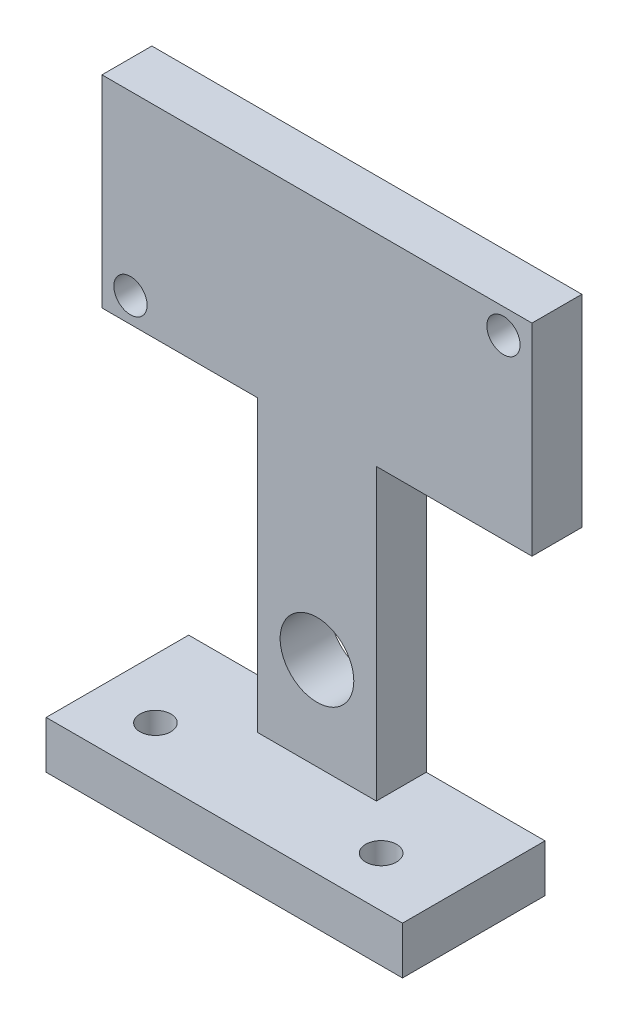
ISO-10303-21;
HEADER;
FILE_DESCRIPTION(('STEP AP214'),'2;1');
FILE_NAME('part.step','',(''),(''),'','','');
FILE_SCHEMA(('AUTOMOTIVE_DESIGN { 1 0 10303 214 1 1 1 1 }'));
ENDSEC;
DATA;
#1=APPLICATION_CONTEXT('core data for automotive mechanical design processes');
#2=APPLICATION_PROTOCOL_DEFINITION('international standard','automotive_design',2000,#1);
#3=PRODUCT_CONTEXT('',#1,'mechanical');
#4=PRODUCT('Part','Part','',(#3));
#5=PRODUCT_RELATED_PRODUCT_CATEGORY('part','',(#4));
#6=PRODUCT_DEFINITION_FORMATION('','',#4);
#7=PRODUCT_DEFINITION_CONTEXT('part definition',#1,'design');
#8=PRODUCT_DEFINITION('design','',#6,#7);
#9=PRODUCT_DEFINITION_SHAPE('','',#8);
#10=(LENGTH_UNIT() NAMED_UNIT(*) SI_UNIT(.MILLI.,.METRE.));
#11=(NAMED_UNIT(*) PLANE_ANGLE_UNIT() SI_UNIT($,.RADIAN.));
#12=(NAMED_UNIT(*) SI_UNIT($,.STERADIAN.) SOLID_ANGLE_UNIT());
#13=UNCERTAINTY_MEASURE_WITH_UNIT(LENGTH_MEASURE(1.E-05),#10,'distance_accuracy_value','');
#14=(GEOMETRIC_REPRESENTATION_CONTEXT(3) GLOBAL_UNCERTAINTY_ASSIGNED_CONTEXT((#13)) GLOBAL_UNIT_ASSIGNED_CONTEXT((#10,
#11,#12)) REPRESENTATION_CONTEXT('',''));
#15=CARTESIAN_POINT('',(0.,0.,0.));
#16=DIRECTION('',(0.,0.,1.));
#17=DIRECTION('',(1.,0.,0.));
#18=AXIS2_PLACEMENT_3D('',#15,#16,#17);
#19=CARTESIAN_POINT('',(-100.96160810836,-5.08,-61.813229454098));
#20=DIRECTION('',(-1.,0.,0.));
#21=DIRECTION('',(0.,0.,1.));
#22=AXIS2_PLACEMENT_3D('',#19,#20,#21);
#23=PLANE('',#22);
#24=DIRECTION('',(0.,0.,1.));
#25=VECTOR('',#24,1.);
#26=CARTESIAN_POINT('',(-100.96160810836,0.,-61.813229454098));
#27=LINE('',#26,#25);
#28=CARTESIAN_POINT('',(-100.96160810836,0.,-61.813229454098));
#29=VERTEX_POINT('',#28);
#30=CARTESIAN_POINT('',(-100.96160810836,0.,-46.573229454098));
#31=VERTEX_POINT('',#30);
#32=EDGE_CURVE('E226',#29,#31,#27,.T.);
#33=ORIENTED_EDGE('',*,*,#32,.F.);
#34=DIRECTION('',(0.,1.,0.));
#35=VECTOR('',#34,1.);
#36=CARTESIAN_POINT('',(-100.96160810836,-5.08,-61.813229454098));
#37=LINE('',#36,#35);
#38=CARTESIAN_POINT('',(-100.96160810836,-5.08,-61.813229454098));
#39=VERTEX_POINT('',#38);
#40=EDGE_CURVE('E11',#39,#29,#37,.T.);
#41=ORIENTED_EDGE('',*,*,#40,.F.);
#42=DIRECTION('',(0.,0.,1.));
#43=VECTOR('',#42,1.);
#44=CARTESIAN_POINT('',(-100.96160810836,-5.08,-61.813229454098));
#45=LINE('',#44,#43);
#46=CARTESIAN_POINT('',(-100.96160810836,-5.08,-46.573229454098));
#47=VERTEX_POINT('',#46);
#48=EDGE_CURVE('E229',#39,#47,#45,.T.);
#49=ORIENTED_EDGE('',*,*,#48,.T.);
#50=DIRECTION('',(0.,1.,0.));
#51=VECTOR('',#50,1.);
#52=CARTESIAN_POINT('',(-100.96160810836,-5.08,-46.573229454098));
#53=LINE('',#52,#51);
#54=EDGE_CURVE('E242',#47,#31,#53,.T.);
#55=ORIENTED_EDGE('',*,*,#54,.T.);
#56=EDGE_LOOP('',(#33,#41,#49,#55));
#57=FACE_BOUND('',#56,.T.);
#58=ADVANCED_FACE('F33',(#57),#23,.T.);
#59=CARTESIAN_POINT('',(-100.96160810836,-5.08,-61.813229454098));
#60=DIRECTION('',(0.,0.,-1.));
#61=DIRECTION('',(-1.,0.,0.));
#62=AXIS2_PLACEMENT_3D('',#59,#60,#61);
#63=PLANE('',#62);
#64=CARTESIAN_POINT('',(-81.91160810836,9.90599999999999,-61.813229454098));
#65=DIRECTION('',(0.,0.,-1.));
#66=DIRECTION('',(-1.,0.,0.));
#67=AXIS2_PLACEMENT_3D('',#64,#65,#66);
#68=CIRCLE('',#67,3.937);
#69=CARTESIAN_POINT('',(-85.84860810836,9.90599999999999,-61.813229454098));
#70=VERTEX_POINT('',#69);
#71=EDGE_CURVE('E345',#70,#70,#68,.T.);
#72=ORIENTED_EDGE('',*,*,#71,.F.);
#73=EDGE_LOOP('',(#72));
#74=FACE_BOUND('',#73,.T.);
#75=CARTESIAN_POINT('',(-61.97260810836,49.911,-61.813229454098));
#76=DIRECTION('',(0.,0.,-1.));
#77=DIRECTION('',(-1.,0.,0.));
#78=AXIS2_PLACEMENT_3D('',#75,#76,#77);
#79=CIRCLE('',#78,1.77800000000001);
#80=CARTESIAN_POINT('',(-63.75060810836,49.911,-61.813229454098));
#81=VERTEX_POINT('',#80);
#82=EDGE_CURVE('E355',#81,#81,#79,.T.);
#83=ORIENTED_EDGE('',*,*,#82,.F.);
#84=EDGE_LOOP('',(#83));
#85=FACE_BOUND('',#84,.T.);
#86=CARTESIAN_POINT('',(-101.85060810836,33.655,-61.813229454098));
#87=DIRECTION('',(0.,0.,-1.));
#88=DIRECTION('',(-1.,0.,0.));
#89=AXIS2_PLACEMENT_3D('',#86,#87,#88);
#90=CIRCLE('',#89,1.77800000000001);
#91=CARTESIAN_POINT('',(-103.62860810836,33.655,-61.813229454098));
#92=VERTEX_POINT('',#91);
#93=EDGE_CURVE('E361',#92,#92,#90,.T.);
#94=ORIENTED_EDGE('',*,*,#93,.F.);
#95=EDGE_LOOP('',(#94));
#96=FACE_BOUND('',#95,.T.);
#97=DIRECTION('',(-1.,0.,0.));
#98=VECTOR('',#97,1.);
#99=CARTESIAN_POINT('',(-100.96160810836,0.,-61.813229454098));
#100=LINE('',#99,#98);
#101=CARTESIAN_POINT('',(-62.86160810836,0.,-61.813229454098));
#102=VERTEX_POINT('',#101);
#103=CARTESIAN_POINT('',(-75.56160810836,0.,-61.813229454098));
#104=VERTEX_POINT('',#103);
#105=EDGE_CURVE('E233',#102,#104,#100,.T.);
#106=ORIENTED_EDGE('',*,*,#105,.F.);
#107=DIRECTION('',(0.,1.,0.));
#108=VECTOR('',#107,1.);
#109=CARTESIAN_POINT('',(-62.86160810836,-5.08,-61.813229454098));
#110=LINE('',#109,#108);
#111=CARTESIAN_POINT('',(-62.86160810836,-5.08,-61.813229454098));
#112=VERTEX_POINT('',#111);
#113=EDGE_CURVE('E41',#112,#102,#110,.T.);
#114=ORIENTED_EDGE('',*,*,#113,.F.);
#115=DIRECTION('',(-1.,0.,0.));
#116=VECTOR('',#115,1.);
#117=CARTESIAN_POINT('',(-100.96160810836,-5.08,-61.813229454098));
#118=LINE('',#117,#116);
#119=EDGE_CURVE('E239',#112,#39,#118,.T.);
#120=ORIENTED_EDGE('',*,*,#119,.T.);
#121=ORIENTED_EDGE('',*,*,#40,.T.);
#122=CARTESIAN_POINT('',(-88.26160810836,0.,-61.813229454098));
#123=VERTEX_POINT('',#122);
#124=EDGE_CURVE('E251',#123,#29,#100,.T.);
#125=ORIENTED_EDGE('',*,*,#124,.F.);
#126=DIRECTION('',(0.,-1.,0.));
#127=VECTOR('',#126,1.);
#128=CARTESIAN_POINT('',(-88.26160810836,30.988,-61.813229454098));
#129=LINE('',#128,#127);
#130=CARTESIAN_POINT('',(-88.26160810836,30.988,-61.813229454098));
#131=VERTEX_POINT('',#130);
#132=EDGE_CURVE('E184',#131,#123,#129,.T.);
#133=ORIENTED_EDGE('',*,*,#132,.F.);
#134=DIRECTION('',(-1.,0.,0.));
#135=VECTOR('',#134,1.);
#136=CARTESIAN_POINT('',(-104.89860810836,30.988,-61.813229454098));
#137=LINE('',#136,#135);
#138=CARTESIAN_POINT('',(-104.89860810836,30.988,-61.813229454098));
#139=VERTEX_POINT('',#138);
#140=EDGE_CURVE('E157',#131,#139,#137,.T.);
#141=ORIENTED_EDGE('',*,*,#140,.T.);
#142=DIRECTION('',(0.,-1.,0.));
#143=VECTOR('',#142,1.);
#144=CARTESIAN_POINT('',(-104.89860810836,52.578,-61.813229454098));
#145=LINE('',#144,#143);
#146=CARTESIAN_POINT('',(-104.89860810836,52.578,-61.813229454098));
#147=VERTEX_POINT('',#146);
#148=EDGE_CURVE('E164',#147,#139,#145,.T.);
#149=ORIENTED_EDGE('',*,*,#148,.F.);
#150=DIRECTION('',(-1.,0.,0.));
#151=VECTOR('',#150,1.);
#152=CARTESIAN_POINT('',(-104.89860810836,52.578,-61.813229454098));
#153=LINE('',#152,#151);
#154=CARTESIAN_POINT('',(-58.92460810836,52.578,-61.813229454098));
#155=VERTEX_POINT('',#154);
#156=EDGE_CURVE('E139',#155,#147,#153,.T.);
#157=ORIENTED_EDGE('',*,*,#156,.F.);
#158=DIRECTION('',(0.,-1.,0.));
#159=VECTOR('',#158,1.);
#160=CARTESIAN_POINT('',(-58.92460810836,52.578,-61.813229454098));
#161=LINE('',#160,#159);
#162=CARTESIAN_POINT('',(-58.92460810836,30.988,-61.813229454098));
#163=VERTEX_POINT('',#162);
#164=EDGE_CURVE('E150',#155,#163,#161,.T.);
#165=ORIENTED_EDGE('',*,*,#164,.T.);
#166=CARTESIAN_POINT('',(-75.56160810836,30.988,-61.813229454098));
#167=VERTEX_POINT('',#166);
#168=EDGE_CURVE('E143',#163,#167,#137,.T.);
#169=ORIENTED_EDGE('',*,*,#168,.T.);
#170=DIRECTION('',(0.,-1.,0.));
#171=VECTOR('',#170,1.);
#172=CARTESIAN_POINT('',(-75.56160810836,30.988,-61.813229454098));
#173=LINE('',#172,#171);
#174=EDGE_CURVE('E188',#167,#104,#173,.T.);
#175=ORIENTED_EDGE('',*,*,#174,.T.);
#176=EDGE_LOOP('',(#106,#114,#120,#121,#125,#133,#141,#149,#157,#165,#169,#175));
#177=FACE_BOUND('',#176,.T.);
#178=ADVANCED_FACE('F171',(#74,#85,#96,#177),#63,.T.);
#179=CARTESIAN_POINT('',(-62.86160810836,-5.08,-61.813229454098));
#180=DIRECTION('',(1.,0.,0.));
#181=DIRECTION('',(0.,0.,-1.));
#182=AXIS2_PLACEMENT_3D('',#179,#180,#181);
#183=PLANE('',#182);
#184=DIRECTION('',(0.,0.,-1.));
#185=VECTOR('',#184,1.);
#186=CARTESIAN_POINT('',(-62.86160810836,0.,-61.813229454098));
#187=LINE('',#186,#185);
#188=CARTESIAN_POINT('',(-62.86160810836,0.,-46.573229454098));
#189=VERTEX_POINT('',#188);
#190=EDGE_CURVE('E248',#189,#102,#187,.T.);
#191=ORIENTED_EDGE('',*,*,#190,.F.);
#192=DIRECTION('',(0.,1.,0.));
#193=VECTOR('',#192,1.);
#194=CARTESIAN_POINT('',(-62.86160810836,-5.08,-46.573229454098));
#195=LINE('',#194,#193);
#196=CARTESIAN_POINT('',(-62.86160810836,-5.08,-46.573229454098));
#197=VERTEX_POINT('',#196);
#198=EDGE_CURVE('E259',#197,#189,#195,.T.);
#199=ORIENTED_EDGE('',*,*,#198,.F.);
#200=DIRECTION('',(0.,0.,-1.));
#201=VECTOR('',#200,1.);
#202=CARTESIAN_POINT('',(-62.86160810836,-5.08,-61.813229454098));
#203=LINE('',#202,#201);
#204=EDGE_CURVE('E236',#197,#112,#203,.T.);
#205=ORIENTED_EDGE('',*,*,#204,.T.);
#206=ORIENTED_EDGE('',*,*,#113,.T.);
#207=EDGE_LOOP('',(#191,#199,#205,#206));
#208=FACE_BOUND('',#207,.T.);
#209=ADVANCED_FACE('F262',(#208),#183,.T.);
#210=CARTESIAN_POINT('',(-100.96160810836,-5.08,-46.573229454098));
#211=DIRECTION('',(0.,0.,1.));
#212=DIRECTION('',(1.,0.,0.));
#213=AXIS2_PLACEMENT_3D('',#210,#211,#212);
#214=PLANE('',#213);
#215=DIRECTION('',(1.,0.,0.));
#216=VECTOR('',#215,1.);
#217=CARTESIAN_POINT('',(-100.96160810836,0.,-46.573229454098));
#218=LINE('',#217,#216);
#219=EDGE_CURVE('E245',#31,#189,#218,.T.);
#220=ORIENTED_EDGE('',*,*,#219,.F.);
#221=ORIENTED_EDGE('',*,*,#54,.F.);
#222=DIRECTION('',(1.,0.,0.));
#223=VECTOR('',#222,1.);
#224=CARTESIAN_POINT('',(-100.96160810836,-5.08,-46.573229454098));
#225=LINE('',#224,#223);
#226=EDGE_CURVE('E232',#47,#197,#225,.T.);
#227=ORIENTED_EDGE('',*,*,#226,.T.);
#228=ORIENTED_EDGE('',*,*,#198,.T.);
#229=EDGE_LOOP('',(#220,#221,#227,#228));
#230=FACE_BOUND('',#229,.T.);
#231=ADVANCED_FACE('F270',(#230),#214,.T.);
#232=CARTESIAN_POINT('',(0.,-5.08,0.));
#233=DIRECTION('',(0.,1.,0.));
#234=DIRECTION('',(0.,0.,1.));
#235=AXIS2_PLACEMENT_3D('',#232,#233,#234);
#236=PLANE('',#235);
#237=CARTESIAN_POINT('',(-70.48160810836,-5.08,-51.907229454098));
#238=DIRECTION('',(0.,1.,0.));
#239=DIRECTION('',(0.,0.,1.));
#240=AXIS2_PLACEMENT_3D('',#237,#238,#239);
#241=CIRCLE('',#240,1.65100000000001);
#242=CARTESIAN_POINT('',(-70.48160810836,-5.08,-50.256229454098));
#243=VERTEX_POINT('',#242);
#244=EDGE_CURVE('E208',#243,#243,#241,.T.);
#245=ORIENTED_EDGE('',*,*,#244,.T.);
#246=EDGE_LOOP('',(#245));
#247=FACE_BOUND('',#246,.T.);
#248=CARTESIAN_POINT('',(-94.61160810836,-5.08,-51.907229454098));
#249=DIRECTION('',(0.,1.,0.));
#250=DIRECTION('',(0.,0.,1.));
#251=AXIS2_PLACEMENT_3D('',#248,#249,#250);
#252=CIRCLE('',#251,1.65100000000001);
#253=CARTESIAN_POINT('',(-94.61160810836,-5.08,-50.256229454098));
#254=VERTEX_POINT('',#253);
#255=EDGE_CURVE('E223',#254,#254,#252,.T.);
#256=ORIENTED_EDGE('',*,*,#255,.T.);
#257=EDGE_LOOP('',(#256));
#258=FACE_BOUND('',#257,.T.);
#259=ORIENTED_EDGE('',*,*,#48,.F.);
#260=ORIENTED_EDGE('',*,*,#119,.F.);
#261=ORIENTED_EDGE('',*,*,#204,.F.);
#262=ORIENTED_EDGE('',*,*,#226,.F.);
#263=EDGE_LOOP('',(#259,#260,#261,#262));
#264=FACE_BOUND('',#263,.T.);
#265=ADVANCED_FACE('F274',(#247,#258,#264),#236,.F.);
#266=CARTESIAN_POINT('',(0.,0.,0.));
#267=DIRECTION('',(0.,1.,0.));
#268=DIRECTION('',(0.,0.,1.));
#269=AXIS2_PLACEMENT_3D('',#266,#267,#268);
#270=PLANE('',#269);
#271=DIRECTION('',(0.,0.,1.));
#272=VECTOR('',#271,1.);
#273=CARTESIAN_POINT('',(-88.26160810836,0.,-61.813229454098));
#274=LINE('',#273,#272);
#275=CARTESIAN_POINT('',(-88.26160810836,0.,-56.479229454098));
#276=VERTEX_POINT('',#275);
#277=EDGE_CURVE('E54',#123,#276,#274,.T.);
#278=ORIENTED_EDGE('',*,*,#277,.F.);
#279=ORIENTED_EDGE('',*,*,#124,.T.);
#280=ORIENTED_EDGE('',*,*,#32,.T.);
#281=ORIENTED_EDGE('',*,*,#219,.T.);
#282=ORIENTED_EDGE('',*,*,#190,.T.);
#283=ORIENTED_EDGE('',*,*,#105,.T.);
#284=DIRECTION('',(0.,0.,-1.));
#285=VECTOR('',#284,1.);
#286=CARTESIAN_POINT('',(-75.56160810836,0.,-61.813229454098));
#287=LINE('',#286,#285);
#288=CARTESIAN_POINT('',(-75.56160810836,0.,-56.479229454098));
#289=VERTEX_POINT('',#288);
#290=EDGE_CURVE('E191',#289,#104,#287,.T.);
#291=ORIENTED_EDGE('',*,*,#290,.F.);
#292=DIRECTION('',(1.,0.,0.));
#293=VECTOR('',#292,1.);
#294=CARTESIAN_POINT('',(-88.26160810836,0.,-56.479229454098));
#295=LINE('',#294,#293);
#296=EDGE_CURVE('E49',#276,#289,#295,.T.);
#297=ORIENTED_EDGE('',*,*,#296,.F.);
#298=EDGE_LOOP('',(#278,#279,#280,#281,#282,#283,#291,#297));
#299=FACE_BOUND('',#298,.T.);
#300=CARTESIAN_POINT('',(-70.48160810836,0.,-51.907229454098));
#301=DIRECTION('',(0.,1.,0.));
#302=DIRECTION('',(0.,0.,1.));
#303=AXIS2_PLACEMENT_3D('',#300,#301,#302);
#304=CIRCLE('',#303,1.65100000000001);
#305=CARTESIAN_POINT('',(-70.48160810836,0.,-50.256229454098));
#306=VERTEX_POINT('',#305);
#307=EDGE_CURVE('E215',#306,#306,#304,.T.);
#308=ORIENTED_EDGE('',*,*,#307,.F.);
#309=EDGE_LOOP('',(#308));
#310=FACE_BOUND('',#309,.T.);
#311=CARTESIAN_POINT('',(-94.61160810836,0.,-51.907229454098));
#312=DIRECTION('',(0.,1.,0.));
#313=DIRECTION('',(0.,0.,1.));
#314=AXIS2_PLACEMENT_3D('',#311,#312,#313);
#315=CIRCLE('',#314,1.65100000000001);
#316=CARTESIAN_POINT('',(-94.61160810836,0.,-50.256229454098));
#317=VERTEX_POINT('',#316);
#318=EDGE_CURVE('E221',#317,#317,#315,.T.);
#319=ORIENTED_EDGE('',*,*,#318,.F.);
#320=EDGE_LOOP('',(#319));
#321=FACE_BOUND('',#320,.T.);
#322=ADVANCED_FACE('F265',(#299,#310,#321),#270,.T.);
#323=CARTESIAN_POINT('',(-94.61160810836,-5.08,-51.907229454098));
#324=DIRECTION('',(0.,1.,0.));
#325=DIRECTION('',(0.,0.,1.));
#326=AXIS2_PLACEMENT_3D('',#323,#324,#325);
#327=CYLINDRICAL_SURFACE('',#326,1.65100000000001);
#328=ORIENTED_EDGE('',*,*,#255,.F.);
#329=EDGE_LOOP('',(#328));
#330=FACE_BOUND('',#329,.T.);
#331=ORIENTED_EDGE('',*,*,#318,.T.);
#332=EDGE_LOOP('',(#331));
#333=FACE_BOUND('',#332,.T.);
#334=ADVANCED_FACE('F300',(#330,#333),#327,.F.);
#335=CARTESIAN_POINT('',(-70.48160810836,-5.08,-51.907229454098));
#336=DIRECTION('',(0.,1.,0.));
#337=DIRECTION('',(0.,0.,1.));
#338=AXIS2_PLACEMENT_3D('',#335,#336,#337);
#339=CYLINDRICAL_SURFACE('',#338,1.65100000000001);
#340=ORIENTED_EDGE('',*,*,#244,.F.);
#341=EDGE_LOOP('',(#340));
#342=FACE_BOUND('',#341,.T.);
#343=ORIENTED_EDGE('',*,*,#307,.T.);
#344=EDGE_LOOP('',(#343));
#345=FACE_BOUND('',#344,.T.);
#346=ADVANCED_FACE('F305',(#342,#345),#339,.F.);
#347=CARTESIAN_POINT('',(-88.26160810836,30.988,-61.813229454098));
#348=DIRECTION('',(1.,0.,0.));
#349=DIRECTION('',(0.,0.,-1.));
#350=AXIS2_PLACEMENT_3D('',#347,#348,#349);
#351=PLANE('',#350);
#352=ORIENTED_EDGE('',*,*,#277,.T.);
#353=DIRECTION('',(0.,-1.,0.));
#354=VECTOR('',#353,1.);
#355=CARTESIAN_POINT('',(-88.26160810836,30.988,-56.479229454098));
#356=LINE('',#355,#354);
#357=CARTESIAN_POINT('',(-88.26160810836,30.988,-56.479229454098));
#358=VERTEX_POINT('',#357);
#359=EDGE_CURVE('E214',#358,#276,#356,.T.);
#360=ORIENTED_EDGE('',*,*,#359,.F.);
#361=DIRECTION('',(0.,0.,1.));
#362=VECTOR('',#361,1.);
#363=CARTESIAN_POINT('',(-88.26160810836,30.988,-61.813229454098));
#364=LINE('',#363,#362);
#365=EDGE_CURVE('E185',#131,#358,#364,.T.);
#366=ORIENTED_EDGE('',*,*,#365,.F.);
#367=ORIENTED_EDGE('',*,*,#132,.T.);
#368=EDGE_LOOP('',(#352,#360,#366,#367));
#369=FACE_BOUND('',#368,.T.);
#370=ADVANCED_FACE('F309',(#369),#351,.F.);
#371=CARTESIAN_POINT('',(-88.26160810836,30.988,-56.479229454098));
#372=DIRECTION('',(0.,0.,-1.));
#373=DIRECTION('',(-1.,0.,0.));
#374=AXIS2_PLACEMENT_3D('',#371,#372,#373);
#375=PLANE('',#374);
#376=CARTESIAN_POINT('',(-81.91160810836,9.90599999999999,-56.479229454098));
#377=DIRECTION('',(0.,0.,1.));
#378=DIRECTION('',(1.,0.,0.));
#379=AXIS2_PLACEMENT_3D('',#376,#377,#378);
#380=CIRCLE('',#379,3.937);
#381=CARTESIAN_POINT('',(-77.97460810836,9.90599999999999,-56.479229454098));
#382=VERTEX_POINT('',#381);
#383=EDGE_CURVE('E348',#382,#382,#380,.T.);
#384=ORIENTED_EDGE('',*,*,#383,.F.);
#385=EDGE_LOOP('',(#384));
#386=FACE_BOUND('',#385,.T.);
#387=CARTESIAN_POINT('',(-61.97260810836,49.911,-56.479229454098));
#388=DIRECTION('',(0.,0.,1.));
#389=DIRECTION('',(1.,0.,0.));
#390=AXIS2_PLACEMENT_3D('',#387,#388,#389);
#391=CIRCLE('',#390,1.77800000000001);
#392=CARTESIAN_POINT('',(-60.19460810836,49.911,-56.479229454098));
#393=VERTEX_POINT('',#392);
#394=EDGE_CURVE('E350',#393,#393,#391,.T.);
#395=ORIENTED_EDGE('',*,*,#394,.F.);
#396=EDGE_LOOP('',(#395));
#397=FACE_BOUND('',#396,.T.);
#398=CARTESIAN_POINT('',(-101.85060810836,33.655,-56.479229454098));
#399=DIRECTION('',(0.,0.,1.));
#400=DIRECTION('',(1.,0.,0.));
#401=AXIS2_PLACEMENT_3D('',#398,#399,#400);
#402=CIRCLE('',#401,1.77800000000001);
#403=CARTESIAN_POINT('',(-100.07260810836,33.655,-56.479229454098));
#404=VERTEX_POINT('',#403);
#405=EDGE_CURVE('E358',#404,#404,#402,.T.);
#406=ORIENTED_EDGE('',*,*,#405,.F.);
#407=EDGE_LOOP('',(#406));
#408=FACE_BOUND('',#407,.T.);
#409=ORIENTED_EDGE('',*,*,#296,.T.);
#410=DIRECTION('',(0.,-1.,0.));
#411=VECTOR('',#410,1.);
#412=CARTESIAN_POINT('',(-75.56160810836,30.988,-56.479229454098));
#413=LINE('',#412,#411);
#414=CARTESIAN_POINT('',(-75.56160810836,30.988,-56.479229454098));
#415=VERTEX_POINT('',#414);
#416=EDGE_CURVE('E198',#415,#289,#413,.T.);
#417=ORIENTED_EDGE('',*,*,#416,.F.);
#418=DIRECTION('',(1.,0.,0.));
#419=VECTOR('',#418,1.);
#420=CARTESIAN_POINT('',(-104.89860810836,30.988,-56.479229454098));
#421=LINE('',#420,#419);
#422=CARTESIAN_POINT('',(-58.92460810836,30.988,-56.479229454098));
#423=VERTEX_POINT('',#422);
#424=EDGE_CURVE('E181',#415,#423,#421,.T.);
#425=ORIENTED_EDGE('',*,*,#424,.T.);
#426=DIRECTION('',(0.,-1.,0.));
#427=VECTOR('',#426,1.);
#428=CARTESIAN_POINT('',(-58.92460810836,52.578,-56.479229454098));
#429=LINE('',#428,#427);
#430=CARTESIAN_POINT('',(-58.92460810836,52.578,-56.479229454098));
#431=VERTEX_POINT('',#430);
#432=EDGE_CURVE('E130',#431,#423,#429,.T.);
#433=ORIENTED_EDGE('',*,*,#432,.F.);
#434=DIRECTION('',(1.,0.,0.));
#435=VECTOR('',#434,1.);
#436=CARTESIAN_POINT('',(-104.89860810836,52.578,-56.479229454098));
#437=LINE('',#436,#435);
#438=CARTESIAN_POINT('',(-104.89860810836,52.578,-56.479229454098));
#439=VERTEX_POINT('',#438);
#440=EDGE_CURVE('E122',#439,#431,#437,.T.);
#441=ORIENTED_EDGE('',*,*,#440,.F.);
#442=DIRECTION('',(0.,-1.,0.));
#443=VECTOR('',#442,1.);
#444=CARTESIAN_POINT('',(-104.89860810836,52.578,-56.479229454098));
#445=LINE('',#444,#443);
#446=CARTESIAN_POINT('',(-104.89860810836,30.988,-56.479229454098));
#447=VERTEX_POINT('',#446);
#448=EDGE_CURVE('E127',#439,#447,#445,.T.);
#449=ORIENTED_EDGE('',*,*,#448,.T.);
#450=EDGE_CURVE('E368',#447,#358,#421,.T.);
#451=ORIENTED_EDGE('',*,*,#450,.T.);
#452=ORIENTED_EDGE('',*,*,#359,.T.);
#453=EDGE_LOOP('',(#409,#417,#425,#433,#441,#449,#451,#452));
#454=FACE_BOUND('',#453,.T.);
#455=ADVANCED_FACE('F124',(#386,#397,#408,#454),#375,.F.);
#456=CARTESIAN_POINT('',(-75.56160810836,30.988,-61.813229454098));
#457=DIRECTION('',(-1.,0.,0.));
#458=DIRECTION('',(0.,0.,1.));
#459=AXIS2_PLACEMENT_3D('',#456,#457,#458);
#460=PLANE('',#459);
#461=ORIENTED_EDGE('',*,*,#290,.T.);
#462=ORIENTED_EDGE('',*,*,#174,.F.);
#463=DIRECTION('',(0.,0.,-1.));
#464=VECTOR('',#463,1.);
#465=CARTESIAN_POINT('',(-75.56160810836,30.988,-61.813229454098));
#466=LINE('',#465,#464);
#467=EDGE_CURVE('E180',#415,#167,#466,.T.);
#468=ORIENTED_EDGE('',*,*,#467,.F.);
#469=ORIENTED_EDGE('',*,*,#416,.T.);
#470=EDGE_LOOP('',(#461,#462,#468,#469));
#471=FACE_BOUND('',#470,.T.);
#472=ADVANCED_FACE('F315',(#471),#460,.F.);
#473=CARTESIAN_POINT('',(0.,30.988,0.));
#474=DIRECTION('',(0.,1.,0.));
#475=DIRECTION('',(0.,0.,1.));
#476=AXIS2_PLACEMENT_3D('',#473,#474,#475);
#477=PLANE('',#476);
#478=ORIENTED_EDGE('',*,*,#140,.F.);
#479=ORIENTED_EDGE('',*,*,#365,.T.);
#480=ORIENTED_EDGE('',*,*,#450,.F.);
#481=DIRECTION('',(0.,0.,1.));
#482=VECTOR('',#481,1.);
#483=CARTESIAN_POINT('',(-104.89860810836,30.988,-61.813229454098));
#484=LINE('',#483,#482);
#485=EDGE_CURVE('E147',#139,#447,#484,.T.);
#486=ORIENTED_EDGE('',*,*,#485,.F.);
#487=EDGE_LOOP('',(#478,#479,#480,#486));
#488=FACE_BOUND('',#487,.T.);
#489=ADVANCED_FACE('F319',(#488),#477,.F.);
#490=ORIENTED_EDGE('',*,*,#424,.F.);
#491=ORIENTED_EDGE('',*,*,#467,.T.);
#492=ORIENTED_EDGE('',*,*,#168,.F.);
#493=DIRECTION('',(0.,0.,-1.));
#494=VECTOR('',#493,1.);
#495=CARTESIAN_POINT('',(-58.92460810836,30.988,-61.813229454098));
#496=LINE('',#495,#494);
#497=EDGE_CURVE('E162',#423,#163,#496,.T.);
#498=ORIENTED_EDGE('',*,*,#497,.F.);
#499=EDGE_LOOP('',(#490,#491,#492,#498));
#500=FACE_BOUND('',#499,.T.);
#501=ADVANCED_FACE('F178',(#500),#477,.F.);
#502=CARTESIAN_POINT('',(-104.89860810836,52.578,-61.813229454098));
#503=DIRECTION('',(1.,0.,0.));
#504=DIRECTION('',(0.,0.,-1.));
#505=AXIS2_PLACEMENT_3D('',#502,#503,#504);
#506=PLANE('',#505);
#507=ORIENTED_EDGE('',*,*,#485,.T.);
#508=ORIENTED_EDGE('',*,*,#448,.F.);
#509=DIRECTION('',(0.,0.,1.));
#510=VECTOR('',#509,1.);
#511=CARTESIAN_POINT('',(-104.89860810836,52.578,-61.813229454098));
#512=LINE('',#511,#510);
#513=EDGE_CURVE('E134',#147,#439,#512,.T.);
#514=ORIENTED_EDGE('',*,*,#513,.F.);
#515=ORIENTED_EDGE('',*,*,#148,.T.);
#516=EDGE_LOOP('',(#507,#508,#514,#515));
#517=FACE_BOUND('',#516,.T.);
#518=ADVANCED_FACE('F145',(#517),#506,.F.);
#519=CARTESIAN_POINT('',(-58.92460810836,52.578,-61.813229454098));
#520=DIRECTION('',(-1.,0.,0.));
#521=DIRECTION('',(0.,0.,1.));
#522=AXIS2_PLACEMENT_3D('',#519,#520,#521);
#523=PLANE('',#522);
#524=ORIENTED_EDGE('',*,*,#497,.T.);
#525=ORIENTED_EDGE('',*,*,#164,.F.);
#526=DIRECTION('',(0.,0.,-1.));
#527=VECTOR('',#526,1.);
#528=CARTESIAN_POINT('',(-58.92460810836,52.578,-61.813229454098));
#529=LINE('',#528,#527);
#530=EDGE_CURVE('E133',#431,#155,#529,.T.);
#531=ORIENTED_EDGE('',*,*,#530,.F.);
#532=ORIENTED_EDGE('',*,*,#432,.T.);
#533=EDGE_LOOP('',(#524,#525,#531,#532));
#534=FACE_BOUND('',#533,.T.);
#535=ADVANCED_FACE('F322',(#534),#523,.F.);
#536=CARTESIAN_POINT('',(0.,52.578,0.));
#537=DIRECTION('',(0.,1.,0.));
#538=DIRECTION('',(0.,0.,1.));
#539=AXIS2_PLACEMENT_3D('',#536,#537,#538);
#540=PLANE('',#539);
#541=ORIENTED_EDGE('',*,*,#513,.T.);
#542=ORIENTED_EDGE('',*,*,#440,.T.);
#543=ORIENTED_EDGE('',*,*,#530,.T.);
#544=ORIENTED_EDGE('',*,*,#156,.T.);
#545=EDGE_LOOP('',(#541,#542,#543,#544));
#546=FACE_BOUND('',#545,.T.);
#547=ADVANCED_FACE('F137',(#546),#540,.T.);
#548=CARTESIAN_POINT('',(-101.85060810836,33.655,-61.813279454098));
#549=DIRECTION('',(0.,0.,1.));
#550=DIRECTION('',(1.,0.,0.));
#551=AXIS2_PLACEMENT_3D('',#548,#549,#550);
#552=CYLINDRICAL_SURFACE('',#551,1.77800000000001);
#553=ORIENTED_EDGE('',*,*,#93,.T.);
#554=EDGE_LOOP('',(#553));
#555=FACE_BOUND('',#554,.T.);
#556=ORIENTED_EDGE('',*,*,#405,.T.);
#557=EDGE_LOOP('',(#556));
#558=FACE_BOUND('',#557,.T.);
#559=ADVANCED_FACE('F330',(#555,#558),#552,.F.);
#560=CARTESIAN_POINT('',(-61.97260810836,49.911,-61.813279454098));
#561=DIRECTION('',(0.,0.,1.));
#562=DIRECTION('',(1.,0.,0.));
#563=AXIS2_PLACEMENT_3D('',#560,#561,#562);
#564=CYLINDRICAL_SURFACE('',#563,1.77800000000001);
#565=ORIENTED_EDGE('',*,*,#82,.T.);
#566=EDGE_LOOP('',(#565));
#567=FACE_BOUND('',#566,.T.);
#568=ORIENTED_EDGE('',*,*,#394,.T.);
#569=EDGE_LOOP('',(#568));
#570=FACE_BOUND('',#569,.T.);
#571=ADVANCED_FACE('F333',(#567,#570),#564,.F.);
#572=CARTESIAN_POINT('',(-81.91160810836,9.90599999999999,-61.813279454098));
#573=DIRECTION('',(0.,0.,1.));
#574=DIRECTION('',(1.,0.,0.));
#575=AXIS2_PLACEMENT_3D('',#572,#573,#574);
#576=CYLINDRICAL_SURFACE('',#575,3.937);
#577=ORIENTED_EDGE('',*,*,#71,.T.);
#578=EDGE_LOOP('',(#577));
#579=FACE_BOUND('',#578,.T.);
#580=ORIENTED_EDGE('',*,*,#383,.T.);
#581=EDGE_LOOP('',(#580));
#582=FACE_BOUND('',#581,.T.);
#583=ADVANCED_FACE('F337',(#579,#582),#576,.F.);
#584=CLOSED_SHELL('',(#58,#178,#209,#231,#265,#322,#334,#346,#370,#455,#472,#489,#501,#518,#535,
#547,#559,#571,#583));
#585=MANIFOLD_SOLID_BREP('B2',#584);
#586=ADVANCED_BREP_SHAPE_REPRESENTATION('',(#18,#585),#14);
#587=SHAPE_DEFINITION_REPRESENTATION(#9,#586);
ENDSEC;
END-ISO-10303-21;
